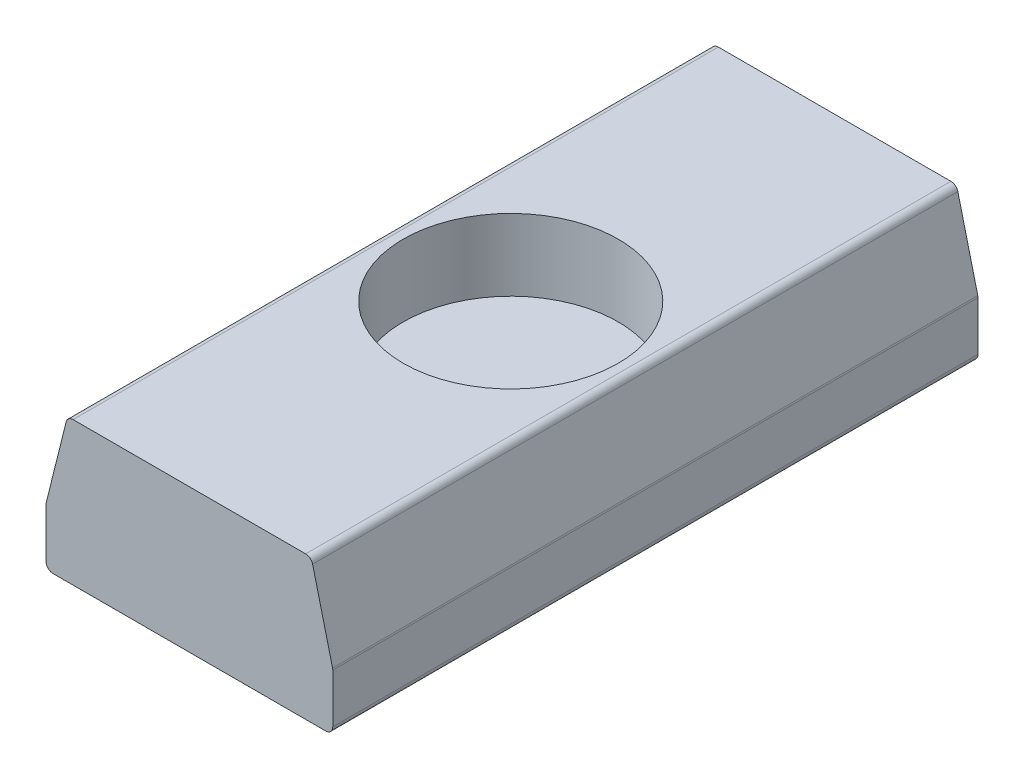
ISO-10303-21;
HEADER;
FILE_DESCRIPTION(('STEP AP214'),'2;1');
FILE_NAME('part.step','',(''),(''),'','','');
FILE_SCHEMA(('AUTOMOTIVE_DESIGN { 1 0 10303 214 1 1 1 1 }'));
ENDSEC;
DATA;
#1=APPLICATION_CONTEXT('core data for automotive mechanical design processes');
#2=APPLICATION_PROTOCOL_DEFINITION('international standard','automotive_design',2000,#1);
#3=PRODUCT_CONTEXT('',#1,'mechanical');
#4=PRODUCT('Part','Part','',(#3));
#5=PRODUCT_RELATED_PRODUCT_CATEGORY('part','',(#4));
#6=PRODUCT_DEFINITION_FORMATION('','',#4);
#7=PRODUCT_DEFINITION_CONTEXT('part definition',#1,'design');
#8=PRODUCT_DEFINITION('design','',#6,#7);
#9=PRODUCT_DEFINITION_SHAPE('','',#8);
#10=(LENGTH_UNIT() NAMED_UNIT(*) SI_UNIT(.MILLI.,.METRE.));
#11=(NAMED_UNIT(*) PLANE_ANGLE_UNIT() SI_UNIT($,.RADIAN.));
#12=(NAMED_UNIT(*) SI_UNIT($,.STERADIAN.) SOLID_ANGLE_UNIT());
#13=UNCERTAINTY_MEASURE_WITH_UNIT(LENGTH_MEASURE(1.E-05),#10,'distance_accuracy_value','');
#14=(GEOMETRIC_REPRESENTATION_CONTEXT(3) GLOBAL_UNCERTAINTY_ASSIGNED_CONTEXT((#13)) GLOBAL_UNIT_ASSIGNED_CONTEXT((#10,
#11,#12)) REPRESENTATION_CONTEXT('',''));
#15=CARTESIAN_POINT('',(0.,0.,0.));
#16=DIRECTION('',(0.,0.,1.));
#17=DIRECTION('',(1.,0.,0.));
#18=AXIS2_PLACEMENT_3D('',#15,#16,#17);
#19=CARTESIAN_POINT('',(0.,10.,90.));
#20=DIRECTION('',(0.,1.,0.));
#21=DIRECTION('',(0.,0.,1.));
#22=AXIS2_PLACEMENT_3D('',#19,#20,#21);
#23=PLANE('',#22);
#24=CARTESIAN_POINT('',(0.,10.,45.1783719103879));
#25=DIRECTION('',(0.,1.,0.));
#26=DIRECTION('',(0.,0.,1.));
#27=AXIS2_PLACEMENT_3D('',#24,#25,#26);
#28=CIRCLE('',#27,15.);
#29=CARTESIAN_POINT('',(0.,10.,60.1783719103879));
#30=VERTEX_POINT('',#29);
#31=EDGE_CURVE('E227',#30,#30,#28,.T.);
#32=ORIENTED_EDGE('',*,*,#31,.F.);
#33=EDGE_LOOP('',(#32));
#34=FACE_BOUND('',#33,.T.);
#35=DIRECTION('',(1.,0.,0.));
#36=VECTOR('',#35,1.);
#37=CARTESIAN_POINT('',(0.,10.,90.));
#38=LINE('',#37,#36);
#39=CARTESIAN_POINT('',(-16.2187143734933,10.,90.));
#40=VERTEX_POINT('',#39);
#41=CARTESIAN_POINT('',(16.2187143734933,10.,90.));
#42=VERTEX_POINT('',#41);
#43=EDGE_CURVE('E161',#40,#42,#38,.T.);
#44=ORIENTED_EDGE('',*,*,#43,.T.);
#45=DIRECTION('',(0.,0.,-1.));
#46=VECTOR('',#45,1.);
#47=CARTESIAN_POINT('',(16.2187143734933,10.,90.));
#48=LINE('',#47,#46);
#49=CARTESIAN_POINT('',(16.2187143734933,10.,0.));
#50=VERTEX_POINT('',#49);
#51=EDGE_CURVE('E197',#42,#50,#48,.T.);
#52=ORIENTED_EDGE('',*,*,#51,.T.);
#53=DIRECTION('',(1.,0.,0.));
#54=VECTOR('',#53,1.);
#55=CARTESIAN_POINT('',(0.,10.,0.));
#56=LINE('',#55,#54);
#57=CARTESIAN_POINT('',(-16.2187143734933,10.,0.));
#58=VERTEX_POINT('',#57);
#59=EDGE_CURVE('E213',#58,#50,#56,.T.);
#60=ORIENTED_EDGE('',*,*,#59,.F.);
#61=DIRECTION('',(0.,0.,-1.));
#62=VECTOR('',#61,1.);
#63=CARTESIAN_POINT('',(-16.2187143734933,10.,90.));
#64=LINE('',#63,#62);
#65=EDGE_CURVE('E195',#58,#40,#64,.F.);
#66=ORIENTED_EDGE('',*,*,#65,.T.);
#67=EDGE_LOOP('',(#44,#52,#60,#66));
#68=FACE_BOUND('',#67,.T.);
#69=ADVANCED_FACE('F33',(#34,#68),#23,.T.);
#70=CARTESIAN_POINT('',(-18.3524123532303,4.57577031938552,90.));
#71=DIRECTION('',(0.970295726275995,-0.241921895599672,0.));
#72=DIRECTION('',(0.241921895599672,0.970295726275996,0.));
#73=AXIS2_PLACEMENT_3D('',#70,#71,#72);
#74=PLANE('',#73);
#75=DIRECTION('',(-0.241921895599672,-0.970295726275996,0.));
#76=VECTOR('',#75,1.);
#77=CARTESIAN_POINT('',(-18.3524123532303,4.57577031938552,0.));
#78=LINE('',#77,#76);
#79=CARTESIAN_POINT('',(-17.1890100997693,9.24192189559967,0.));
#80=VERTEX_POINT('',#79);
#81=CARTESIAN_POINT('',(-19.970295726276,-1.91320546591057,0.));
#82=VERTEX_POINT('',#81);
#83=EDGE_CURVE('E155',#80,#82,#78,.T.);
#84=ORIENTED_EDGE('',*,*,#83,.T.);
#85=DIRECTION('',(0.,0.,-1.));
#86=VECTOR('',#85,1.);
#87=CARTESIAN_POINT('',(-19.970295726276,-1.91320546591057,90.));
#88=LINE('',#87,#86);
#89=CARTESIAN_POINT('',(-19.970295726276,-1.91320546591057,90.));
#90=VERTEX_POINT('',#89);
#91=EDGE_CURVE('E11',#82,#90,#88,.F.);
#92=ORIENTED_EDGE('',*,*,#91,.T.);
#93=DIRECTION('',(-0.241921895599672,-0.970295726275996,0.));
#94=VECTOR('',#93,1.);
#95=CARTESIAN_POINT('',(-18.3524123532303,4.57577031938552,90.));
#96=LINE('',#95,#94);
#97=CARTESIAN_POINT('',(-17.1890100997693,9.24192189559967,90.));
#98=VERTEX_POINT('',#97);
#99=EDGE_CURVE('E208',#98,#90,#96,.T.);
#100=ORIENTED_EDGE('',*,*,#99,.F.);
#101=DIRECTION('',(0.,0.,-1.));
#102=VECTOR('',#101,1.);
#103=CARTESIAN_POINT('',(-17.1890100997693,9.24192189559967,0.));
#104=LINE('',#103,#102);
#105=EDGE_CURVE('E41',#98,#80,#104,.T.);
#106=ORIENTED_EDGE('',*,*,#105,.T.);
#107=EDGE_LOOP('',(#84,#92,#100,#106));
#108=FACE_BOUND('',#107,.T.);
#109=ADVANCED_FACE('F205',(#108),#74,.F.);
#110=CARTESIAN_POINT('',(-20.,0.,90.));
#111=DIRECTION('',(-1.,0.,0.));
#112=DIRECTION('',(0.,0.,1.));
#113=AXIS2_PLACEMENT_3D('',#110,#111,#112);
#114=PLANE('',#113);
#115=DIRECTION('',(0.,1.,0.));
#116=VECTOR('',#115,1.);
#117=CARTESIAN_POINT('',(-20.,0.,0.));
#118=LINE('',#117,#116);
#119=CARTESIAN_POINT('',(-20.,-9.,0.));
#120=VERTEX_POINT('',#119);
#121=CARTESIAN_POINT('',(-20.,-2.15512736151024,0.));
#122=VERTEX_POINT('',#121);
#123=EDGE_CURVE('E150',#120,#122,#118,.T.);
#124=ORIENTED_EDGE('',*,*,#123,.F.);
#125=DIRECTION('',(0.,0.,-1.));
#126=VECTOR('',#125,1.);
#127=CARTESIAN_POINT('',(-20.,-9.,90.));
#128=LINE('',#127,#126);
#129=CARTESIAN_POINT('',(-20.,-9.,90.));
#130=VERTEX_POINT('',#129);
#131=EDGE_CURVE('E128',#120,#130,#128,.F.);
#132=ORIENTED_EDGE('',*,*,#131,.T.);
#133=DIRECTION('',(0.,1.,0.));
#134=VECTOR('',#133,1.);
#135=CARTESIAN_POINT('',(-20.,0.,90.));
#136=LINE('',#135,#134);
#137=CARTESIAN_POINT('',(-20.,-2.15512736151024,90.));
#138=VERTEX_POINT('',#137);
#139=EDGE_CURVE('E221',#130,#138,#136,.T.);
#140=ORIENTED_EDGE('',*,*,#139,.T.);
#141=DIRECTION('',(0.,0.,-1.));
#142=VECTOR('',#141,1.);
#143=CARTESIAN_POINT('',(-20.,-2.15512736151024,0.));
#144=LINE('',#143,#142);
#145=EDGE_CURVE('E133',#138,#122,#144,.T.);
#146=ORIENTED_EDGE('',*,*,#145,.T.);
#147=EDGE_LOOP('',(#124,#132,#140,#146));
#148=FACE_BOUND('',#147,.T.);
#149=ADVANCED_FACE('F267',(#148),#114,.T.);
#150=CARTESIAN_POINT('',(0.,-10.,90.));
#151=DIRECTION('',(0.,1.,0.));
#152=DIRECTION('',(0.,0.,1.));
#153=AXIS2_PLACEMENT_3D('',#150,#151,#152);
#154=PLANE('',#153);
#155=DIRECTION('',(1.,0.,0.));
#156=VECTOR('',#155,1.);
#157=CARTESIAN_POINT('',(0.,-10.,90.));
#158=LINE('',#157,#156);
#159=CARTESIAN_POINT('',(-19.,-10.,90.));
#160=VERTEX_POINT('',#159);
#161=CARTESIAN_POINT('',(19.,-10.,90.));
#162=VERTEX_POINT('',#161);
#163=EDGE_CURVE('E143',#160,#162,#158,.T.);
#164=ORIENTED_EDGE('',*,*,#163,.F.);
#165=DIRECTION('',(0.,0.,-1.));
#166=VECTOR('',#165,1.);
#167=CARTESIAN_POINT('',(-19.,-10.,0.));
#168=LINE('',#167,#166);
#169=CARTESIAN_POINT('',(-19.,-10.,0.));
#170=VERTEX_POINT('',#169);
#171=EDGE_CURVE('E127',#160,#170,#168,.T.);
#172=ORIENTED_EDGE('',*,*,#171,.T.);
#173=DIRECTION('',(1.,0.,0.));
#174=VECTOR('',#173,1.);
#175=CARTESIAN_POINT('',(0.,-10.,0.));
#176=LINE('',#175,#174);
#177=CARTESIAN_POINT('',(19.,-10.,0.));
#178=VERTEX_POINT('',#177);
#179=EDGE_CURVE('E140',#170,#178,#176,.T.);
#180=ORIENTED_EDGE('',*,*,#179,.T.);
#181=DIRECTION('',(0.,0.,-1.));
#182=VECTOR('',#181,1.);
#183=CARTESIAN_POINT('',(19.,-10.,90.));
#184=LINE('',#183,#182);
#185=EDGE_CURVE('E145',#178,#162,#184,.F.);
#186=ORIENTED_EDGE('',*,*,#185,.T.);
#187=EDGE_LOOP('',(#164,#172,#180,#186));
#188=FACE_BOUND('',#187,.T.);
#189=ADVANCED_FACE('F139',(#188),#154,.F.);
#190=CARTESIAN_POINT('',(20.,0.,90.));
#191=DIRECTION('',(-1.,0.,0.));
#192=DIRECTION('',(0.,0.,1.));
#193=AXIS2_PLACEMENT_3D('',#190,#191,#192);
#194=PLANE('',#193);
#195=DIRECTION('',(0.,1.,0.));
#196=VECTOR('',#195,1.);
#197=CARTESIAN_POINT('',(20.,0.,90.));
#198=LINE('',#197,#196);
#199=CARTESIAN_POINT('',(20.,-9.,90.));
#200=VERTEX_POINT('',#199);
#201=CARTESIAN_POINT('',(20.,-2.15512736151018,90.));
#202=VERTEX_POINT('',#201);
#203=EDGE_CURVE('E218',#200,#202,#198,.T.);
#204=ORIENTED_EDGE('',*,*,#203,.F.);
#205=DIRECTION('',(0.,0.,-1.));
#206=VECTOR('',#205,1.);
#207=CARTESIAN_POINT('',(20.,-9.,90.));
#208=LINE('',#207,#206);
#209=CARTESIAN_POINT('',(20.,-9.,0.));
#210=VERTEX_POINT('',#209);
#211=EDGE_CURVE('E188',#200,#210,#208,.T.);
#212=ORIENTED_EDGE('',*,*,#211,.T.);
#213=DIRECTION('',(0.,1.,0.));
#214=VECTOR('',#213,1.);
#215=CARTESIAN_POINT('',(20.,0.,0.));
#216=LINE('',#215,#214);
#217=CARTESIAN_POINT('',(20.,-2.15512736151018,0.));
#218=VERTEX_POINT('',#217);
#219=EDGE_CURVE('E149',#210,#218,#216,.T.);
#220=ORIENTED_EDGE('',*,*,#219,.T.);
#221=DIRECTION('',(0.,0.,-1.));
#222=VECTOR('',#221,1.);
#223=CARTESIAN_POINT('',(20.,-2.15512736151018,90.));
#224=LINE('',#223,#222);
#225=EDGE_CURVE('E186',#218,#202,#224,.F.);
#226=ORIENTED_EDGE('',*,*,#225,.T.);
#227=EDGE_LOOP('',(#204,#212,#220,#226));
#228=FACE_BOUND('',#227,.T.);
#229=ADVANCED_FACE('F257',(#228),#194,.F.);
#230=CARTESIAN_POINT('',(18.3524123532303,4.57577031938553,90.));
#231=DIRECTION('',(0.970295726275995,0.241921895599672,0.));
#232=DIRECTION('',(-0.241921895599672,0.970295726275995,0.));
#233=AXIS2_PLACEMENT_3D('',#230,#231,#232);
#234=PLANE('',#233);
#235=DIRECTION('',(0.241921895599672,-0.970295726275995,0.));
#236=VECTOR('',#235,1.);
#237=CARTESIAN_POINT('',(18.3524123532303,4.57577031938553,90.));
#238=LINE('',#237,#236);
#239=CARTESIAN_POINT('',(17.1890100997693,9.24192189559968,90.));
#240=VERTEX_POINT('',#239);
#241=CARTESIAN_POINT('',(19.970295726276,-1.91320546591051,90.));
#242=VERTEX_POINT('',#241);
#243=EDGE_CURVE('E162',#240,#242,#238,.T.);
#244=ORIENTED_EDGE('',*,*,#243,.T.);
#245=DIRECTION('',(0.,0.,-1.));
#246=VECTOR('',#245,1.);
#247=CARTESIAN_POINT('',(19.970295726276,-1.91320546591051,0.));
#248=LINE('',#247,#246);
#249=CARTESIAN_POINT('',(19.970295726276,-1.91320546591051,0.));
#250=VERTEX_POINT('',#249);
#251=EDGE_CURVE('E192',#242,#250,#248,.T.);
#252=ORIENTED_EDGE('',*,*,#251,.T.);
#253=DIRECTION('',(0.241921895599672,-0.970295726275995,0.));
#254=VECTOR('',#253,1.);
#255=CARTESIAN_POINT('',(18.3524123532303,4.57577031938553,0.));
#256=LINE('',#255,#254);
#257=CARTESIAN_POINT('',(17.1890100997693,9.24192189559968,0.));
#258=VERTEX_POINT('',#257);
#259=EDGE_CURVE('E153',#258,#250,#256,.T.);
#260=ORIENTED_EDGE('',*,*,#259,.F.);
#261=DIRECTION('',(0.,0.,-1.));
#262=VECTOR('',#261,1.);
#263=CARTESIAN_POINT('',(17.1890100997693,9.24192189559967,90.));
#264=LINE('',#263,#262);
#265=EDGE_CURVE('E55',#258,#240,#264,.F.);
#266=ORIENTED_EDGE('',*,*,#265,.T.);
#267=EDGE_LOOP('',(#244,#252,#260,#266));
#268=FACE_BOUND('',#267,.T.);
#269=ADVANCED_FACE('F250',(#268),#234,.T.);
#270=CARTESIAN_POINT('',(0.,0.,90.));
#271=DIRECTION('',(0.,0.,1.));
#272=DIRECTION('',(1.,0.,0.));
#273=AXIS2_PLACEMENT_3D('',#270,#271,#272);
#274=PLANE('',#273);
#275=ORIENTED_EDGE('',*,*,#139,.F.);
#276=CARTESIAN_POINT('',(-19.,-9.,90.));
#277=DIRECTION('',(0.,0.,1.));
#278=DIRECTION('',(1.,0.,0.));
#279=AXIS2_PLACEMENT_3D('',#276,#277,#278);
#280=CIRCLE('',#279,1.);
#281=EDGE_CURVE('E184',#130,#160,#280,.T.);
#282=ORIENTED_EDGE('',*,*,#281,.T.);
#283=ORIENTED_EDGE('',*,*,#163,.T.);
#284=CARTESIAN_POINT('',(19.,-9.,90.));
#285=DIRECTION('',(0.,0.,1.));
#286=DIRECTION('',(1.,0.,0.));
#287=AXIS2_PLACEMENT_3D('',#284,#285,#286);
#288=CIRCLE('',#287,1.);
#289=EDGE_CURVE('E182',#162,#200,#288,.T.);
#290=ORIENTED_EDGE('',*,*,#289,.T.);
#291=ORIENTED_EDGE('',*,*,#203,.T.);
#292=CARTESIAN_POINT('',(19.,-2.15512736151018,90.));
#293=DIRECTION('',(0.,0.,1.));
#294=DIRECTION('',(1.,0.,0.));
#295=AXIS2_PLACEMENT_3D('',#292,#293,#294);
#296=CIRCLE('',#295,1.);
#297=EDGE_CURVE('E48',#202,#242,#296,.T.);
#298=ORIENTED_EDGE('',*,*,#297,.T.);
#299=ORIENTED_EDGE('',*,*,#243,.F.);
#300=CARTESIAN_POINT('',(16.2187143734933,9.,90.));
#301=DIRECTION('',(0.,0.,1.));
#302=DIRECTION('',(1.,0.,0.));
#303=AXIS2_PLACEMENT_3D('',#300,#301,#302);
#304=CIRCLE('',#303,1.);
#305=EDGE_CURVE('E179',#240,#42,#304,.T.);
#306=ORIENTED_EDGE('',*,*,#305,.T.);
#307=ORIENTED_EDGE('',*,*,#43,.F.);
#308=CARTESIAN_POINT('',(-16.2187143734933,9.,90.));
#309=DIRECTION('',(0.,0.,1.));
#310=DIRECTION('',(1.,0.,0.));
#311=AXIS2_PLACEMENT_3D('',#308,#309,#310);
#312=CIRCLE('',#311,1.);
#313=EDGE_CURVE('E175',#40,#98,#312,.T.);
#314=ORIENTED_EDGE('',*,*,#313,.T.);
#315=ORIENTED_EDGE('',*,*,#99,.T.);
#316=CARTESIAN_POINT('',(-19.,-2.15512736151024,90.));
#317=DIRECTION('',(0.,0.,1.));
#318=DIRECTION('',(1.,0.,0.));
#319=AXIS2_PLACEMENT_3D('',#316,#317,#318);
#320=CIRCLE('',#319,1.);
#321=EDGE_CURVE('E177',#90,#138,#320,.T.);
#322=ORIENTED_EDGE('',*,*,#321,.T.);
#323=EDGE_LOOP('',(#275,#282,#283,#290,#291,#298,#299,#306,#307,#314,#315,#322));
#324=FACE_BOUND('',#323,.T.);
#325=ADVANCED_FACE('F263',(#324),#274,.T.);
#326=CARTESIAN_POINT('',(0.,0.,0.));
#327=DIRECTION('',(0.,0.,1.));
#328=DIRECTION('',(1.,0.,0.));
#329=AXIS2_PLACEMENT_3D('',#326,#327,#328);
#330=PLANE('',#329);
#331=ORIENTED_EDGE('',*,*,#179,.F.);
#332=CARTESIAN_POINT('',(-19.,-9.,0.));
#333=DIRECTION('',(0.,0.,1.));
#334=DIRECTION('',(1.,0.,0.));
#335=AXIS2_PLACEMENT_3D('',#332,#333,#334);
#336=CIRCLE('',#335,1.);
#337=EDGE_CURVE('E123',#170,#120,#336,.F.);
#338=ORIENTED_EDGE('',*,*,#337,.T.);
#339=ORIENTED_EDGE('',*,*,#123,.T.);
#340=CARTESIAN_POINT('',(-19.,-2.15512736151024,0.));
#341=DIRECTION('',(0.,0.,1.));
#342=DIRECTION('',(1.,0.,0.));
#343=AXIS2_PLACEMENT_3D('',#340,#341,#342);
#344=CIRCLE('',#343,1.);
#345=EDGE_CURVE('E165',#122,#82,#344,.F.);
#346=ORIENTED_EDGE('',*,*,#345,.T.);
#347=ORIENTED_EDGE('',*,*,#83,.F.);
#348=CARTESIAN_POINT('',(-16.2187143734933,9.,0.));
#349=DIRECTION('',(0.,0.,1.));
#350=DIRECTION('',(1.,0.,0.));
#351=AXIS2_PLACEMENT_3D('',#348,#349,#350);
#352=CIRCLE('',#351,1.);
#353=EDGE_CURVE('E144',#80,#58,#352,.F.);
#354=ORIENTED_EDGE('',*,*,#353,.T.);
#355=ORIENTED_EDGE('',*,*,#59,.T.);
#356=CARTESIAN_POINT('',(16.2187143734933,9.,0.));
#357=DIRECTION('',(0.,0.,1.));
#358=DIRECTION('',(1.,0.,0.));
#359=AXIS2_PLACEMENT_3D('',#356,#357,#358);
#360=CIRCLE('',#359,1.);
#361=EDGE_CURVE('E167',#50,#258,#360,.F.);
#362=ORIENTED_EDGE('',*,*,#361,.T.);
#363=ORIENTED_EDGE('',*,*,#259,.T.);
#364=CARTESIAN_POINT('',(19.,-2.15512736151018,0.));
#365=DIRECTION('',(0.,0.,1.));
#366=DIRECTION('',(1.,0.,0.));
#367=AXIS2_PLACEMENT_3D('',#364,#365,#366);
#368=CIRCLE('',#367,1.);
#369=EDGE_CURVE('E169',#250,#218,#368,.F.);
#370=ORIENTED_EDGE('',*,*,#369,.T.);
#371=ORIENTED_EDGE('',*,*,#219,.F.);
#372=CARTESIAN_POINT('',(19.,-9.,0.));
#373=DIRECTION('',(0.,0.,1.));
#374=DIRECTION('',(1.,0.,0.));
#375=AXIS2_PLACEMENT_3D('',#372,#373,#374);
#376=CIRCLE('',#375,1.);
#377=EDGE_CURVE('E134',#210,#178,#376,.F.);
#378=ORIENTED_EDGE('',*,*,#377,.T.);
#379=EDGE_LOOP('',(#331,#338,#339,#346,#347,#354,#355,#362,#363,#370,#371,#378));
#380=FACE_BOUND('',#379,.T.);
#381=ADVANCED_FACE('F147',(#380),#330,.F.);
#382=CARTESIAN_POINT('',(-19.,-9.,90.));
#383=DIRECTION('',(0.,0.,1.));
#384=DIRECTION('',(1.,0.,0.));
#385=AXIS2_PLACEMENT_3D('',#382,#383,#384);
#386=CYLINDRICAL_SURFACE('',#385,1.);
#387=ORIENTED_EDGE('',*,*,#281,.F.);
#388=ORIENTED_EDGE('',*,*,#131,.F.);
#389=ORIENTED_EDGE('',*,*,#337,.F.);
#390=ORIENTED_EDGE('',*,*,#171,.F.);
#391=EDGE_LOOP('',(#387,#388,#389,#390));
#392=FACE_BOUND('',#391,.T.);
#393=ADVANCED_FACE('F126',(#392),#386,.T.);
#394=CARTESIAN_POINT('',(19.,-9.,90.));
#395=DIRECTION('',(0.,0.,-1.));
#396=DIRECTION('',(-1.,0.,0.));
#397=AXIS2_PLACEMENT_3D('',#394,#395,#396);
#398=CYLINDRICAL_SURFACE('',#397,1.);
#399=ORIENTED_EDGE('',*,*,#289,.F.);
#400=ORIENTED_EDGE('',*,*,#185,.F.);
#401=ORIENTED_EDGE('',*,*,#377,.F.);
#402=ORIENTED_EDGE('',*,*,#211,.F.);
#403=EDGE_LOOP('',(#399,#400,#401,#402));
#404=FACE_BOUND('',#403,.T.);
#405=ADVANCED_FACE('F261',(#404),#398,.T.);
#406=CARTESIAN_POINT('',(19.,-2.15512736151018,90.));
#407=DIRECTION('',(0.,0.,1.));
#408=DIRECTION('',(1.,0.,0.));
#409=AXIS2_PLACEMENT_3D('',#406,#407,#408);
#410=CYLINDRICAL_SURFACE('',#409,1.);
#411=ORIENTED_EDGE('',*,*,#297,.F.);
#412=ORIENTED_EDGE('',*,*,#225,.F.);
#413=ORIENTED_EDGE('',*,*,#369,.F.);
#414=ORIENTED_EDGE('',*,*,#251,.F.);
#415=EDGE_LOOP('',(#411,#412,#413,#414));
#416=FACE_BOUND('',#415,.T.);
#417=ADVANCED_FACE('F253',(#416),#410,.T.);
#418=CARTESIAN_POINT('',(16.2187143734933,9.,90.));
#419=DIRECTION('',(0.,0.,-1.));
#420=DIRECTION('',(-1.,0.,0.));
#421=AXIS2_PLACEMENT_3D('',#418,#419,#420);
#422=CYLINDRICAL_SURFACE('',#421,1.);
#423=ORIENTED_EDGE('',*,*,#305,.F.);
#424=ORIENTED_EDGE('',*,*,#265,.F.);
#425=ORIENTED_EDGE('',*,*,#361,.F.);
#426=ORIENTED_EDGE('',*,*,#51,.F.);
#427=EDGE_LOOP('',(#423,#424,#425,#426));
#428=FACE_BOUND('',#427,.T.);
#429=ADVANCED_FACE('F249',(#428),#422,.T.);
#430=CARTESIAN_POINT('',(-19.,-2.15512736151024,90.));
#431=DIRECTION('',(0.,0.,1.));
#432=DIRECTION('',(1.,0.,0.));
#433=AXIS2_PLACEMENT_3D('',#430,#431,#432);
#434=CYLINDRICAL_SURFACE('',#433,1.);
#435=ORIENTED_EDGE('',*,*,#321,.F.);
#436=ORIENTED_EDGE('',*,*,#91,.F.);
#437=ORIENTED_EDGE('',*,*,#345,.F.);
#438=ORIENTED_EDGE('',*,*,#145,.F.);
#439=EDGE_LOOP('',(#435,#436,#437,#438));
#440=FACE_BOUND('',#439,.T.);
#441=ADVANCED_FACE('F269',(#440),#434,.T.);
#442=CARTESIAN_POINT('',(-16.2187143734933,9.,90.));
#443=DIRECTION('',(0.,0.,1.));
#444=DIRECTION('',(1.,0.,0.));
#445=AXIS2_PLACEMENT_3D('',#442,#443,#444);
#446=CYLINDRICAL_SURFACE('',#445,1.);
#447=ORIENTED_EDGE('',*,*,#313,.F.);
#448=ORIENTED_EDGE('',*,*,#65,.F.);
#449=ORIENTED_EDGE('',*,*,#353,.F.);
#450=ORIENTED_EDGE('',*,*,#105,.F.);
#451=EDGE_LOOP('',(#447,#448,#449,#450));
#452=FACE_BOUND('',#451,.T.);
#453=ADVANCED_FACE('F35',(#452),#446,.T.);
#454=CARTESIAN_POINT('',(0.,0.,45.1783719103879));
#455=DIRECTION('',(0.,1.,0.));
#456=DIRECTION('',(0.,0.,1.));
#457=AXIS2_PLACEMENT_3D('',#454,#455,#456);
#458=CYLINDRICAL_SURFACE('',#457,15.);
#459=CARTESIAN_POINT('',(0.,0.,45.1783719103879));
#460=DIRECTION('',(0.,1.,0.));
#461=DIRECTION('',(0.,0.,1.));
#462=AXIS2_PLACEMENT_3D('',#459,#460,#461);
#463=CIRCLE('',#462,15.);
#464=CARTESIAN_POINT('',(0.,0.,60.1783719103879));
#465=VERTEX_POINT('',#464);
#466=EDGE_CURVE('E214',#465,#465,#463,.T.);
#467=ORIENTED_EDGE('',*,*,#466,.F.);
#468=EDGE_LOOP('',(#467));
#469=FACE_BOUND('',#468,.T.);
#470=ORIENTED_EDGE('',*,*,#31,.T.);
#471=EDGE_LOOP('',(#470));
#472=FACE_BOUND('',#471,.T.);
#473=ADVANCED_FACE('F235',(#469,#472),#458,.F.);
#474=CARTESIAN_POINT('',(0.,0.,45.1783719103879));
#475=DIRECTION('',(0.,1.,0.));
#476=DIRECTION('',(0.,0.,1.));
#477=AXIS2_PLACEMENT_3D('',#474,#475,#476);
#478=PLANE('',#477);
#479=ORIENTED_EDGE('',*,*,#466,.T.);
#480=EDGE_LOOP('',(#479));
#481=FACE_BOUND('',#480,.T.);
#482=ADVANCED_FACE('F233',(#481),#478,.T.);
#483=CLOSED_SHELL('',(#69,#109,#149,#189,#229,#269,#325,#381,#393,#405,#417,#429,#441,#453,#473,#482));
#484=MANIFOLD_SOLID_BREP('B2',#483);
#485=ADVANCED_BREP_SHAPE_REPRESENTATION('',(#18,#484),#14);
#486=SHAPE_DEFINITION_REPRESENTATION(#9,#485);
ENDSEC;
END-ISO-10303-21;
